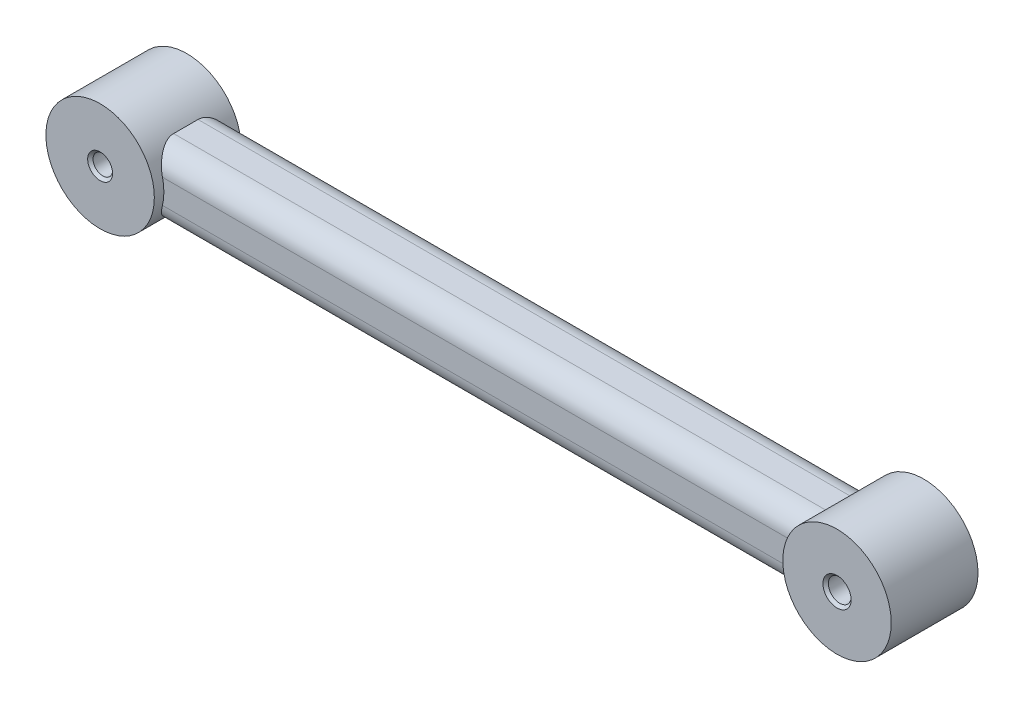
ISO-10303-21;
HEADER;
FILE_DESCRIPTION(('STEP AP214'),'2;1');
FILE_NAME('part.step','',(''),(''),'','','');
FILE_SCHEMA(('AUTOMOTIVE_DESIGN { 1 0 10303 214 1 1 1 1 }'));
ENDSEC;
DATA;
#1=APPLICATION_CONTEXT('core data for automotive mechanical design processes');
#2=APPLICATION_PROTOCOL_DEFINITION('international standard','automotive_design',2000,#1);
#3=PRODUCT_CONTEXT('',#1,'mechanical');
#4=PRODUCT('Part','Part','',(#3));
#5=PRODUCT_RELATED_PRODUCT_CATEGORY('part','',(#4));
#6=PRODUCT_DEFINITION_FORMATION('','',#4);
#7=PRODUCT_DEFINITION_CONTEXT('part definition',#1,'design');
#8=PRODUCT_DEFINITION('design','',#6,#7);
#9=PRODUCT_DEFINITION_SHAPE('','',#8);
#10=(LENGTH_UNIT() NAMED_UNIT(*) SI_UNIT(.MILLI.,.METRE.));
#11=(NAMED_UNIT(*) PLANE_ANGLE_UNIT() SI_UNIT($,.RADIAN.));
#12=(NAMED_UNIT(*) SI_UNIT($,.STERADIAN.) SOLID_ANGLE_UNIT());
#13=UNCERTAINTY_MEASURE_WITH_UNIT(LENGTH_MEASURE(1.E-05),#10,'distance_accuracy_value','');
#14=(GEOMETRIC_REPRESENTATION_CONTEXT(3) GLOBAL_UNCERTAINTY_ASSIGNED_CONTEXT((#13)) GLOBAL_UNIT_ASSIGNED_CONTEXT((#10,
#11,#12)) REPRESENTATION_CONTEXT('',''));
#15=CARTESIAN_POINT('',(0.,0.,0.));
#16=DIRECTION('',(0.,0.,1.));
#17=DIRECTION('',(1.,0.,0.));
#18=AXIS2_PLACEMENT_3D('',#15,#16,#17);
#19=CARTESIAN_POINT('',(0.,0.,1.6));
#20=DIRECTION('',(0.,0.,-1.));
#21=DIRECTION('',(-1.,0.,0.));
#22=AXIS2_PLACEMENT_3D('',#19,#20,#21);
#23=CYLINDRICAL_SURFACE('',#22,2.);
#24=CARTESIAN_POINT('',(0.,0.,-1.6));
#25=DIRECTION('',(0.,0.,1.));
#26=DIRECTION('',(1.,0.,0.));
#27=AXIS2_PLACEMENT_3D('',#24,#25,#26);
#28=CIRCLE('',#27,2.);
#29=CARTESIAN_POINT('',(2.,0.,-1.6));
#30=VERTEX_POINT('',#29);
#31=EDGE_CURVE('E237',#30,#30,#28,.T.);
#32=ORIENTED_EDGE('',*,*,#31,.T.);
#33=EDGE_LOOP('',(#32));
#34=FACE_BOUND('',#33,.T.);
#35=CARTESIAN_POINT('',(0.,0.,1.6));
#36=DIRECTION('',(0.,0.,1.));
#37=DIRECTION('',(1.,0.,0.));
#38=AXIS2_PLACEMENT_3D('',#35,#36,#37);
#39=CIRCLE('',#38,2.);
#40=CARTESIAN_POINT('',(2.,0.,1.6));
#41=VERTEX_POINT('',#40);
#42=EDGE_CURVE('E233',#41,#41,#39,.T.);
#43=ORIENTED_EDGE('',*,*,#42,.F.);
#44=EDGE_LOOP('',(#43));
#45=FACE_BOUND('',#44,.T.);
#46=DIRECTION('',(0.,0.,-1.));
#47=VECTOR('',#46,1.);
#48=CARTESIAN_POINT('',(1.5612494995996,-1.25,1.6));
#49=LINE('',#48,#47);
#50=CARTESIAN_POINT('',(1.5612494995996,-1.25,0.450000000000001));
#51=VERTEX_POINT('',#50);
#52=CARTESIAN_POINT('',(1.5612494995996,-1.25,-0.45));
#53=VERTEX_POINT('',#52);
#54=EDGE_CURVE('E219',#51,#53,#49,.T.);
#55=ORIENTED_EDGE('',*,*,#54,.F.);
#56=CARTESIAN_POINT('',(1.5612494995996,-1.25,0.45));
#57=CARTESIAN_POINT('',(1.56124479428022,-1.250002364679,0.469703834155344));
#58=CARTESIAN_POINT('',(1.56183295074108,-1.24927153588386,0.489395317765744));
#59=CARTESIAN_POINT('',(1.56414858771914,-1.24637255435479,0.528587471484426));
#60=CARTESIAN_POINT('',(1.56587504631508,-1.24420569082532,0.548088296836796));
#61=CARTESIAN_POINT('',(1.57265355833478,-1.23564369882374,0.605764718422303));
#62=CARTESIAN_POINT('',(1.57930646800638,-1.22718597796565,0.643470105465648));
#63=CARTESIAN_POINT('',(1.5960669332859,-1.20530323861858,0.716395942969233));
#64=CARTESIAN_POINT('',(1.60616327133415,-1.19189433787044,0.751624019761468));
#65=CARTESIAN_POINT('',(1.62887659158212,-1.16066109928091,0.819258018595459));
#66=CARTESIAN_POINT('',(1.64149889578509,-1.14282741943866,0.851657771016151));
#67=CARTESIAN_POINT('',(1.66990848408761,-1.10096145860698,0.916817729501131));
#68=CARTESIAN_POINT('',(1.68589310993983,-1.07644967178315,0.949182251801828));
#69=CARTESIAN_POINT('',(1.71878299353934,-1.02311710435887,1.00960930066279));
#70=CARTESIAN_POINT('',(1.73568878390636,-0.994293813661595,1.03766930178723));
#71=CARTESIAN_POINT('',(1.77256367788873,-0.92721693875738,1.09382072076917));
#72=CARTESIAN_POINT('',(1.79253574310543,-0.888199992628021,1.12100636177458));
#73=CARTESIAN_POINT('',(1.83117439570147,-0.805531046068749,1.16823481281907));
#74=CARTESIAN_POINT('',(1.84984238883931,-0.761884168581074,1.18828541282545));
#75=CARTESIAN_POINT('',(1.8833595926855,-0.674506987774179,1.2191298319953));
#76=CARTESIAN_POINT('',(1.89839579822248,-0.631071205150889,1.23054306875258));
#77=CARTESIAN_POINT('',(1.91889376673093,-0.564265641648953,1.24212284582033));
#78=CARTESIAN_POINT('',(1.92539633411464,-0.541667631727136,1.24505975103717));
#79=CARTESIAN_POINT('',(1.93764293008773,-0.496083613033455,1.24899940564504));
#80=CARTESIAN_POINT('',(1.94338640315115,-0.473097333838141,1.25000074575873));
#81=CARTESIAN_POINT('',(1.94871752699051,-0.45,1.25));
#82=B_SPLINE_CURVE_WITH_KNOTS('',3,(#56,#57,#58,#59,#60,#61,#62,#63,#64,#65,#66,#67,#68,#69,#70,
#71,#72,#73,#74,#75,#76,#77,#78,#79,#80,#81),.UNSPECIFIED.,.F.,.F.,(4,2,2,2,2,2,2,2,2,2,2,2,4),
(0.,0.0590660793421097,0.118079203637748,0.23505440101746,0.351652114854425,0.468498127104217,
0.598923157775744,0.72942441773895,0.88344553410579,1.0372979720476,1.17865837614105,
1.24966769193779,1.32072868989235),.UNSPECIFIED.);
#83=CARTESIAN_POINT('',(1.94871752699051,-0.45,1.25));
#84=VERTEX_POINT('',#83);
#85=EDGE_CURVE('E118',#51,#84,#82,.T.);
#86=ORIENTED_EDGE('',*,*,#85,.T.);
#87=CARTESIAN_POINT('',(0.,0.,1.25));
#88=DIRECTION('',(0.,0.,-1.));
#89=DIRECTION('',(-1.,0.,0.));
#90=AXIS2_PLACEMENT_3D('',#87,#88,#89);
#91=CIRCLE('',#90,2.);
#92=CARTESIAN_POINT('',(1.94871752699051,0.45,1.25));
#93=VERTEX_POINT('',#92);
#94=EDGE_CURVE('E218',#84,#93,#91,.F.);
#95=ORIENTED_EDGE('',*,*,#94,.T.);
#96=CARTESIAN_POINT('',(1.94871752699051,0.45,1.25));
#97=CARTESIAN_POINT('',(1.94338425116083,0.473106310050768,1.25000063558548));
#98=CARTESIAN_POINT('',(1.93763853728271,0.496101044505794,1.24899859691571));
#99=CARTESIAN_POINT('',(1.92538658640089,0.541702836848775,1.24505601023878));
#100=CARTESIAN_POINT('',(1.91888086470596,0.564310145634009,1.24211676950984));
#101=CARTESIAN_POINT('',(1.89838873777709,0.631089346347298,1.23053666798972));
#102=CARTESIAN_POINT('',(1.88336348007658,0.674492429826167,1.21913175950723));
#103=CARTESIAN_POINT('',(1.85133334222158,0.758001767367756,1.18965912006261));
#104=CARTESIAN_POINT('',(1.83433328040023,0.798115654751751,1.17160738235327));
#105=CARTESIAN_POINT('',(1.79914706863792,0.874553038881213,1.12945760485428));
#106=CARTESIAN_POINT('',(1.78095882710302,0.91086954196344,1.10534867790625));
#107=CARTESIAN_POINT('',(1.74277618145345,0.982091956315179,1.04925982679008));
#108=CARTESIAN_POINT('',(1.72276420051192,1.01658962475138,1.01677262281048));
#109=CARTESIAN_POINT('',(1.68397655896571,1.07962539252384,0.945804261028445));
#110=CARTESIAN_POINT('',(1.66520041451233,1.10816583382209,0.907325469122972));
#111=CARTESIAN_POINT('',(1.63391881310515,1.15365721123185,0.832626911371097));
#112=CARTESIAN_POINT('',(1.62089769828072,1.17177780146066,0.797336304039981));
#113=CARTESIAN_POINT('',(1.59801388195562,1.20279757990867,0.72365280845195));
#114=CARTESIAN_POINT('',(1.58814151632969,1.21571277730878,0.685269874441344));
#115=CARTESIAN_POINT('',(1.57424806585875,1.23363312678441,0.614227371281108));
#116=CARTESIAN_POINT('',(1.5694450551216,1.23971316496546,0.581992767531099));
#117=CARTESIAN_POINT('',(1.56291265911081,1.24792324765895,0.516528801126634));
#118=CARTESIAN_POINT('',(1.56120186968704,1.25002939749622,0.483294634017954));
#119=CARTESIAN_POINT('',(1.5612494995996,1.25,0.45));
#120=B_SPLINE_CURVE_WITH_KNOTS('',3,(#96,#97,#98,#99,#100,#101,#102,#103,#104,#105,#106,#107,
#108,#109,#110,#111,#112,#113,#114,#115,#116,#117,#118,#119),.UNSPECIFIED.,.F.,.F.,(4,2,2,2,2,2,
2,2,2,2,2,4),(0.,0.071087690328124,0.142127457741706,0.283374885535946,0.424284648686768,
0.565449517193962,0.719088835422086,0.872667639259163,0.997450974212655,1.1218475547457,
1.22092759027445,1.32060151077974),.UNSPECIFIED.);
#121=CARTESIAN_POINT('',(1.5612494995996,1.25,0.450000000000001));
#122=VERTEX_POINT('',#121);
#123=EDGE_CURVE('E63',#93,#122,#120,.T.);
#124=ORIENTED_EDGE('',*,*,#123,.T.);
#125=DIRECTION('',(0.,0.,-1.));
#126=VECTOR('',#125,1.);
#127=CARTESIAN_POINT('',(1.5612494995996,1.25,1.6));
#128=LINE('',#127,#126);
#129=CARTESIAN_POINT('',(1.5612494995996,1.25,-0.45));
#130=VERTEX_POINT('',#129);
#131=EDGE_CURVE('E212',#122,#130,#128,.T.);
#132=ORIENTED_EDGE('',*,*,#131,.T.);
#133=CARTESIAN_POINT('',(1.5612494995996,1.25,-0.45));
#134=CARTESIAN_POINT('',(1.56124479428022,1.250002364679,-0.469703834155343));
#135=CARTESIAN_POINT('',(1.56183295074108,1.24927153588386,-0.489395317765743));
#136=CARTESIAN_POINT('',(1.56414858771914,1.24637255435479,-0.528587471484425));
#137=CARTESIAN_POINT('',(1.56587504631508,1.24420569082532,-0.548088296836795));
#138=CARTESIAN_POINT('',(1.57265355833478,1.23564369882374,-0.605764718422302));
#139=CARTESIAN_POINT('',(1.57930646800638,1.22718597796565,-0.643470105465647));
#140=CARTESIAN_POINT('',(1.59606693328591,1.20530323861858,-0.716395942969233));
#141=CARTESIAN_POINT('',(1.60616327133415,1.19189433787044,-0.751624019761467));
#142=CARTESIAN_POINT('',(1.62887659158212,1.16066109928091,-0.819258018595458));
#143=CARTESIAN_POINT('',(1.64149889578509,1.14282741943866,-0.85165777101615));
#144=CARTESIAN_POINT('',(1.66990848408761,1.10096145860698,-0.91681772950113));
#145=CARTESIAN_POINT('',(1.68589310993983,1.07644967178315,-0.949182251801827));
#146=CARTESIAN_POINT('',(1.71878299353934,1.02311710435887,-1.00960930066279));
#147=CARTESIAN_POINT('',(1.73568878390636,0.994293813661594,-1.03766930178723));
#148=CARTESIAN_POINT('',(1.77256367788873,0.927216938757379,-1.09382072076917));
#149=CARTESIAN_POINT('',(1.79253574310543,0.88819999262802,-1.12100636177458));
#150=CARTESIAN_POINT('',(1.83117439570147,0.805531046068748,-1.16823481281907));
#151=CARTESIAN_POINT('',(1.84984238883931,0.761884168581073,-1.18828541282545));
#152=CARTESIAN_POINT('',(1.8833595926855,0.674506987774178,-1.2191298319953));
#153=CARTESIAN_POINT('',(1.89839579822248,0.631071205150887,-1.23054306875258));
#154=CARTESIAN_POINT('',(1.91889376673094,0.564265641648952,-1.24212284582033));
#155=CARTESIAN_POINT('',(1.92539633411464,0.541667631727135,-1.24505975103717));
#156=CARTESIAN_POINT('',(1.93764293008773,0.496083613033454,-1.24899940564504));
#157=CARTESIAN_POINT('',(1.94338640315115,0.47309733383814,-1.25000074575873));
#158=CARTESIAN_POINT('',(1.94871752699051,0.45,-1.25));
#159=B_SPLINE_CURVE_WITH_KNOTS('',3,(#133,#134,#135,#136,#137,#138,#139,#140,#141,#142,#143,
#144,#145,#146,#147,#148,#149,#150,#151,#152,#153,#154,#155,#156,#157,#158),.UNSPECIFIED.,.F.,
.F.,(4,2,2,2,2,2,2,2,2,2,2,2,4),(0.,0.0590660793421097,0.118079203637748,0.23505440101746,
0.351652114854425,0.468498127104217,0.598923157775744,0.72942441773895,0.88344553410579,
1.0372979720476,1.17865837614105,1.24966769193779,1.32072868989235),.UNSPECIFIED.);
#160=CARTESIAN_POINT('',(1.94871752699051,0.45,-1.25));
#161=VERTEX_POINT('',#160);
#162=EDGE_CURVE('E49',#130,#161,#159,.T.);
#163=ORIENTED_EDGE('',*,*,#162,.T.);
#164=CARTESIAN_POINT('',(0.,0.,-1.25));
#165=DIRECTION('',(0.,0.,-1.));
#166=DIRECTION('',(-1.,0.,0.));
#167=AXIS2_PLACEMENT_3D('',#164,#165,#166);
#168=CIRCLE('',#167,2.);
#169=CARTESIAN_POINT('',(1.94871752699051,-0.45,-1.25));
#170=VERTEX_POINT('',#169);
#171=EDGE_CURVE('E211',#170,#161,#168,.F.);
#172=ORIENTED_EDGE('',*,*,#171,.F.);
#173=CARTESIAN_POINT('',(1.94871752699051,-0.45,-1.25));
#174=CARTESIAN_POINT('',(1.94338425116083,-0.473106310050769,-1.25000063558548));
#175=CARTESIAN_POINT('',(1.93763853728271,-0.496101044505794,-1.24899859691571));
#176=CARTESIAN_POINT('',(1.92538658640089,-0.541702836848776,-1.24505601023877));
#177=CARTESIAN_POINT('',(1.91888086470596,-0.564310145634009,-1.24211676950984));
#178=CARTESIAN_POINT('',(1.89838873777709,-0.631089346347298,-1.23053666798971));
#179=CARTESIAN_POINT('',(1.88336348007658,-0.674492429826168,-1.21913175950723));
#180=CARTESIAN_POINT('',(1.85133334222158,-0.758001767367757,-1.18965912006261));
#181=CARTESIAN_POINT('',(1.83433328040023,-0.798115654751752,-1.17160738235327));
#182=CARTESIAN_POINT('',(1.79914706863792,-0.874553038881214,-1.12945760485428));
#183=CARTESIAN_POINT('',(1.78095882710302,-0.910869541963441,-1.10534867790625));
#184=CARTESIAN_POINT('',(1.74277618145345,-0.98209195631518,-1.04925982679007));
#185=CARTESIAN_POINT('',(1.72276420051192,-1.01658962475138,-1.01677262281048));
#186=CARTESIAN_POINT('',(1.68397655896571,-1.07962539252384,-0.945804261028444));
#187=CARTESIAN_POINT('',(1.66520041451233,-1.10816583382209,-0.907325469122971));
#188=CARTESIAN_POINT('',(1.63391881310515,-1.15365721123185,-0.832626911371095));
#189=CARTESIAN_POINT('',(1.62089769828072,-1.17177780146066,-0.79733630403998));
#190=CARTESIAN_POINT('',(1.59801388195562,-1.20279757990867,-0.723652808451949));
#191=CARTESIAN_POINT('',(1.58814151632969,-1.21571277730878,-0.685269874441342));
#192=CARTESIAN_POINT('',(1.57424806585875,-1.23363312678441,-0.614227371281107));
#193=CARTESIAN_POINT('',(1.5694450551216,-1.23971316496546,-0.581992767531098));
#194=CARTESIAN_POINT('',(1.56291265911081,-1.24792324765895,-0.516528801126633));
#195=CARTESIAN_POINT('',(1.56120186968704,-1.25002939749622,-0.483294634017953));
#196=CARTESIAN_POINT('',(1.5612494995996,-1.25,-0.45));
#197=B_SPLINE_CURVE_WITH_KNOTS('',3,(#173,#174,#175,#176,#177,#178,#179,#180,#181,#182,#183,
#184,#185,#186,#187,#188,#189,#190,#191,#192,#193,#194,#195,#196),.UNSPECIFIED.,.F.,.F.,(4,2,2,
2,2,2,2,2,2,2,2,4),(0.,0.0710876903281239,0.142127457741706,0.283374885535946,0.424284648686768,
0.565449517193962,0.719088835422086,0.872667639259164,0.997450974212656,1.1218475547457,
1.22092759027445,1.32060151077974),.UNSPECIFIED.);
#198=EDGE_CURVE('E117',#170,#53,#197,.T.);
#199=ORIENTED_EDGE('',*,*,#198,.T.);
#200=EDGE_LOOP('',(#55,#86,#95,#124,#132,#163,#172,#199));
#201=FACE_BOUND('',#200,.T.);
#202=ADVANCED_FACE('F36',(#34,#45,#201),#23,.T.);
#203=CARTESIAN_POINT('',(0.,0.,1.6));
#204=DIRECTION('',(0.,0.,1.));
#205=DIRECTION('',(1.,0.,0.));
#206=AXIS2_PLACEMENT_3D('',#203,#204,#205);
#207=PLANE('',#206);
#208=CARTESIAN_POINT('',(0.,0.,1.6));
#209=DIRECTION('',(0.,0.,1.));
#210=DIRECTION('',(1.,0.,0.));
#211=AXIS2_PLACEMENT_3D('',#208,#209,#210);
#212=CIRCLE('',#211,0.459999999999999);
#213=CARTESIAN_POINT('',(0.459999999999999,0.,1.6));
#214=VERTEX_POINT('',#213);
#215=EDGE_CURVE('E257',#214,#214,#212,.F.);
#216=ORIENTED_EDGE('',*,*,#215,.T.);
#217=EDGE_LOOP('',(#216));
#218=FACE_BOUND('',#217,.T.);
#219=ORIENTED_EDGE('',*,*,#42,.T.);
#220=EDGE_LOOP('',(#219));
#221=FACE_BOUND('',#220,.T.);
#222=ADVANCED_FACE('F275',(#218,#221),#207,.T.);
#223=CARTESIAN_POINT('',(0.,0.,-1.6));
#224=DIRECTION('',(0.,0.,1.));
#225=DIRECTION('',(1.,0.,0.));
#226=AXIS2_PLACEMENT_3D('',#223,#224,#225);
#227=PLANE('',#226);
#228=CARTESIAN_POINT('',(0.,0.,-1.6));
#229=DIRECTION('',(0.,0.,1.));
#230=DIRECTION('',(1.,0.,0.));
#231=AXIS2_PLACEMENT_3D('',#228,#229,#230);
#232=CIRCLE('',#231,0.459999999999995);
#233=CARTESIAN_POINT('',(0.459999999999995,0.,-1.6));
#234=VERTEX_POINT('',#233);
#235=EDGE_CURVE('E136',#234,#234,#232,.T.);
#236=ORIENTED_EDGE('',*,*,#235,.T.);
#237=EDGE_LOOP('',(#236));
#238=FACE_BOUND('',#237,.T.);
#239=ORIENTED_EDGE('',*,*,#31,.F.);
#240=EDGE_LOOP('',(#239));
#241=FACE_BOUND('',#240,.T.);
#242=ADVANCED_FACE('F262',(#238,#241),#227,.F.);
#243=CARTESIAN_POINT('',(0.,0.,1.6));
#244=DIRECTION('',(0.,0.,-1.));
#245=DIRECTION('',(-1.,0.,0.));
#246=AXIS2_PLACEMENT_3D('',#243,#244,#245);
#247=CYLINDRICAL_SURFACE('',#246,0.36);
#248=CARTESIAN_POINT('',(0.,0.,1.5));
#249=DIRECTION('',(0.,0.,1.));
#250=DIRECTION('',(1.,0.,0.));
#251=AXIS2_PLACEMENT_3D('',#248,#249,#250);
#252=CIRCLE('',#251,0.36);
#253=CARTESIAN_POINT('',(0.36,0.,1.5));
#254=VERTEX_POINT('',#253);
#255=EDGE_CURVE('E254',#254,#254,#252,.T.);
#256=ORIENTED_EDGE('',*,*,#255,.T.);
#257=EDGE_LOOP('',(#256));
#258=FACE_BOUND('',#257,.T.);
#259=CARTESIAN_POINT('',(0.,0.,-1.5));
#260=DIRECTION('',(0.,0.,1.));
#261=DIRECTION('',(1.,0.,0.));
#262=AXIS2_PLACEMENT_3D('',#259,#260,#261);
#263=CIRCLE('',#262,0.36);
#264=CARTESIAN_POINT('',(0.36,0.,-1.5));
#265=VERTEX_POINT('',#264);
#266=EDGE_CURVE('E251',#265,#265,#263,.F.);
#267=ORIENTED_EDGE('',*,*,#266,.T.);
#268=EDGE_LOOP('',(#267));
#269=FACE_BOUND('',#268,.T.);
#270=ADVANCED_FACE('F287',(#258,#269),#247,.F.);
#271=CARTESIAN_POINT('',(29.181718048039,-1.25,0.));
#272=DIRECTION('',(0.,1.,0.));
#273=DIRECTION('',(0.,0.,1.));
#274=AXIS2_PLACEMENT_3D('',#271,#272,#273);
#275=PLANE('',#274);
#276=DIRECTION('',(0.,0.,-1.));
#277=VECTOR('',#276,1.);
#278=CARTESIAN_POINT('',(25.6194685484394,-1.25,1.6));
#279=LINE('',#278,#277);
#280=CARTESIAN_POINT('',(25.6194685484394,-1.25,0.450000000000001));
#281=VERTEX_POINT('',#280);
#282=CARTESIAN_POINT('',(25.6194685484394,-1.25,-0.45));
#283=VERTEX_POINT('',#282);
#284=EDGE_CURVE('E110',#281,#283,#279,.T.);
#285=ORIENTED_EDGE('',*,*,#284,.F.);
#286=DIRECTION('',(-1.,0.,0.));
#287=VECTOR('',#286,1.);
#288=CARTESIAN_POINT('',(1.5612494995996,-1.25,0.45));
#289=LINE('',#288,#287);
#290=EDGE_CURVE('E124',#281,#51,#289,.T.);
#291=ORIENTED_EDGE('',*,*,#290,.T.);
#292=ORIENTED_EDGE('',*,*,#54,.T.);
#293=DIRECTION('',(-1.,0.,0.));
#294=VECTOR('',#293,1.);
#295=CARTESIAN_POINT('',(29.181718048039,-1.25,-0.45));
#296=LINE('',#295,#294);
#297=EDGE_CURVE('E127',#53,#283,#296,.F.);
#298=ORIENTED_EDGE('',*,*,#297,.T.);
#299=EDGE_LOOP('',(#285,#291,#292,#298));
#300=FACE_BOUND('',#299,.T.);
#301=ADVANCED_FACE('F122',(#300),#275,.F.);
#302=CARTESIAN_POINT('',(29.181718048039,0.,-1.25));
#303=DIRECTION('',(0.,0.,1.));
#304=DIRECTION('',(1.,0.,0.));
#305=AXIS2_PLACEMENT_3D('',#302,#303,#304);
#306=PLANE('',#305);
#307=CARTESIAN_POINT('',(27.180718048039,0.,-1.25));
#308=DIRECTION('',(0.,0.,1.));
#309=DIRECTION('',(1.,0.,0.));
#310=AXIS2_PLACEMENT_3D('',#307,#308,#309);
#311=CIRCLE('',#310,2.);
#312=CARTESIAN_POINT('',(25.2320005210485,-0.450000000000001,-1.25));
#313=VERTEX_POINT('',#312);
#314=CARTESIAN_POINT('',(25.2320005210485,0.45,-1.25));
#315=VERTEX_POINT('',#314);
#316=EDGE_CURVE('E128',#313,#315,#311,.F.);
#317=ORIENTED_EDGE('',*,*,#316,.F.);
#318=DIRECTION('',(-1.,0.,0.));
#319=VECTOR('',#318,1.);
#320=CARTESIAN_POINT('',(29.181718048039,-0.45,-1.25));
#321=LINE('',#320,#319);
#322=EDGE_CURVE('E143',#313,#170,#321,.T.);
#323=ORIENTED_EDGE('',*,*,#322,.T.);
#324=ORIENTED_EDGE('',*,*,#171,.T.);
#325=DIRECTION('',(-1.,0.,0.));
#326=VECTOR('',#325,1.);
#327=CARTESIAN_POINT('',(25.6194685484394,0.45,-1.25));
#328=LINE('',#327,#326);
#329=EDGE_CURVE('E141',#161,#315,#328,.F.);
#330=ORIENTED_EDGE('',*,*,#329,.T.);
#331=EDGE_LOOP('',(#317,#323,#324,#330));
#332=FACE_BOUND('',#331,.T.);
#333=ADVANCED_FACE('F215',(#332),#306,.F.);
#334=CARTESIAN_POINT('',(29.181718048039,1.25,0.));
#335=DIRECTION('',(0.,1.,0.));
#336=DIRECTION('',(0.,0.,1.));
#337=AXIS2_PLACEMENT_3D('',#334,#335,#336);
#338=PLANE('',#337);
#339=ORIENTED_EDGE('',*,*,#131,.F.);
#340=DIRECTION('',(-1.,0.,0.));
#341=VECTOR('',#340,1.);
#342=CARTESIAN_POINT('',(29.181718048039,1.25,0.45));
#343=LINE('',#342,#341);
#344=CARTESIAN_POINT('',(25.6194685484394,1.25,0.450000000000001));
#345=VERTEX_POINT('',#344);
#346=EDGE_CURVE('E148',#122,#345,#343,.F.);
#347=ORIENTED_EDGE('',*,*,#346,.T.);
#348=DIRECTION('',(0.,0.,-1.));
#349=VECTOR('',#348,1.);
#350=CARTESIAN_POINT('',(25.6194685484394,1.25,1.6));
#351=LINE('',#350,#349);
#352=CARTESIAN_POINT('',(25.6194685484394,1.25,-0.45));
#353=VERTEX_POINT('',#352);
#354=EDGE_CURVE('E224',#345,#353,#351,.T.);
#355=ORIENTED_EDGE('',*,*,#354,.T.);
#356=DIRECTION('',(-1.,0.,0.));
#357=VECTOR('',#356,1.);
#358=CARTESIAN_POINT('',(1.5612494995996,1.25,-0.45));
#359=LINE('',#358,#357);
#360=EDGE_CURVE('E146',#353,#130,#359,.T.);
#361=ORIENTED_EDGE('',*,*,#360,.T.);
#362=EDGE_LOOP('',(#339,#347,#355,#361));
#363=FACE_BOUND('',#362,.T.);
#364=ADVANCED_FACE('F227',(#363),#338,.T.);
#365=CARTESIAN_POINT('',(29.181718048039,0.,1.25));
#366=DIRECTION('',(0.,0.,1.));
#367=DIRECTION('',(1.,0.,0.));
#368=AXIS2_PLACEMENT_3D('',#365,#366,#367);
#369=PLANE('',#368);
#370=ORIENTED_EDGE('',*,*,#94,.F.);
#371=DIRECTION('',(-1.,0.,0.));
#372=VECTOR('',#371,1.);
#373=CARTESIAN_POINT('',(25.6194685484394,-0.45,1.25));
#374=LINE('',#373,#372);
#375=CARTESIAN_POINT('',(25.2320005210485,-0.450000000000001,1.25));
#376=VERTEX_POINT('',#375);
#377=EDGE_CURVE('E134',#84,#376,#374,.F.);
#378=ORIENTED_EDGE('',*,*,#377,.T.);
#379=CARTESIAN_POINT('',(27.180718048039,0.,1.25));
#380=DIRECTION('',(0.,0.,1.));
#381=DIRECTION('',(1.,0.,0.));
#382=AXIS2_PLACEMENT_3D('',#379,#380,#381);
#383=CIRCLE('',#382,2.);
#384=CARTESIAN_POINT('',(25.2320005210485,0.45,1.25));
#385=VERTEX_POINT('',#384);
#386=EDGE_CURVE('E113',#376,#385,#383,.F.);
#387=ORIENTED_EDGE('',*,*,#386,.T.);
#388=DIRECTION('',(-1.,0.,0.));
#389=VECTOR('',#388,1.);
#390=CARTESIAN_POINT('',(29.181718048039,0.45,1.25));
#391=LINE('',#390,#389);
#392=EDGE_CURVE('E131',#385,#93,#391,.T.);
#393=ORIENTED_EDGE('',*,*,#392,.T.);
#394=EDGE_LOOP('',(#370,#378,#387,#393));
#395=FACE_BOUND('',#394,.T.);
#396=ADVANCED_FACE('F194',(#395),#369,.T.);
#397=CARTESIAN_POINT('',(27.180718048039,0.,1.6));
#398=DIRECTION('',(0.,0.,-1.));
#399=DIRECTION('',(-1.,0.,0.));
#400=AXIS2_PLACEMENT_3D('',#397,#398,#399);
#401=CYLINDRICAL_SURFACE('',#400,2.);
#402=CARTESIAN_POINT('',(27.180718048039,0.,1.6));
#403=DIRECTION('',(0.,0.,1.));
#404=DIRECTION('',(1.,0.,0.));
#405=AXIS2_PLACEMENT_3D('',#402,#403,#404);
#406=CIRCLE('',#405,2.);
#407=CARTESIAN_POINT('',(29.180718048039,0.,1.6));
#408=VERTEX_POINT('',#407);
#409=EDGE_CURVE('E416',#408,#408,#406,.T.);
#410=ORIENTED_EDGE('',*,*,#409,.F.);
#411=EDGE_LOOP('',(#410));
#412=FACE_BOUND('',#411,.T.);
#413=CARTESIAN_POINT('',(27.180718048039,0.,-1.6));
#414=DIRECTION('',(0.,0.,1.));
#415=DIRECTION('',(1.,0.,0.));
#416=AXIS2_PLACEMENT_3D('',#413,#414,#415);
#417=CIRCLE('',#416,2.);
#418=CARTESIAN_POINT('',(29.180718048039,0.,-1.6));
#419=VERTEX_POINT('',#418);
#420=EDGE_CURVE('E418',#419,#419,#417,.T.);
#421=ORIENTED_EDGE('',*,*,#420,.T.);
#422=EDGE_LOOP('',(#421));
#423=FACE_BOUND('',#422,.T.);
#424=ORIENTED_EDGE('',*,*,#386,.F.);
#425=CARTESIAN_POINT('',(25.2320005210485,-0.45,1.25));
#426=CARTESIAN_POINT('',(25.2373337968782,-0.473106310050769,1.25000063558548));
#427=CARTESIAN_POINT('',(25.2430795107563,-0.496101044505795,1.24899859691571));
#428=CARTESIAN_POINT('',(25.2553314616381,-0.541702836848777,1.24505601023878));
#429=CARTESIAN_POINT('',(25.261837183333,-0.56431014563401,1.24211676950984));
#430=CARTESIAN_POINT('',(25.2823293102619,-0.631089346347299,1.23053666798971));
#431=CARTESIAN_POINT('',(25.2973545679624,-0.674492429826169,1.21913175950723));
#432=CARTESIAN_POINT('',(25.3293847058174,-0.758001767367757,1.18965912006261));
#433=CARTESIAN_POINT('',(25.3463847676388,-0.798115654751752,1.17160738235327));
#434=CARTESIAN_POINT('',(25.3815709794011,-0.874553038881214,1.12945760485428));
#435=CARTESIAN_POINT('',(25.399759220936,-0.910869541963441,1.10534867790625));
#436=CARTESIAN_POINT('',(25.4379418665856,-0.982091956315181,1.04925982679008));
#437=CARTESIAN_POINT('',(25.4579538475271,-1.01658962475138,1.01677262281048));
#438=CARTESIAN_POINT('',(25.4967414890733,-1.07962539252384,0.945804261028445));
#439=CARTESIAN_POINT('',(25.5155176335267,-1.10816583382209,0.907325469122972));
#440=CARTESIAN_POINT('',(25.5467992349339,-1.15365721123185,0.832626911371096));
#441=CARTESIAN_POINT('',(25.5598203497583,-1.17177780146066,0.79733630403998));
#442=CARTESIAN_POINT('',(25.5827041660834,-1.20279757990867,0.723652808451949));
#443=CARTESIAN_POINT('',(25.5925765317093,-1.21571277730878,0.685269874441343));
#444=CARTESIAN_POINT('',(25.6064699821803,-1.23363312678441,0.614227371281108));
#445=CARTESIAN_POINT('',(25.6112729929174,-1.23971316496546,0.581992767531098));
#446=CARTESIAN_POINT('',(25.6178053889282,-1.24792324765895,0.516528801126633));
#447=CARTESIAN_POINT('',(25.619516178352,-1.25002939749622,0.483294634017953));
#448=CARTESIAN_POINT('',(25.6194685484394,-1.25,0.45));
#449=B_SPLINE_CURVE_WITH_KNOTS('',3,(#425,#426,#427,#428,#429,#430,#431,#432,#433,#434,#435,
#436,#437,#438,#439,#440,#441,#442,#443,#444,#445,#446,#447,#448),.UNSPECIFIED.,.F.,.F.,(4,2,2,
2,2,2,2,2,2,2,2,4),(0.,0.0710876903281248,0.142127457741707,0.283374885535946,0.424284648686768,
0.565449517193963,0.719088835422086,0.872667639259164,0.997450974212657,1.1218475547457,
1.22092759027445,1.32060151077974),.UNSPECIFIED.);
#450=EDGE_CURVE('E107',#376,#281,#449,.T.);
#451=ORIENTED_EDGE('',*,*,#450,.T.);
#452=ORIENTED_EDGE('',*,*,#284,.T.);
#453=CARTESIAN_POINT('',(25.6194685484394,-1.25,-0.45));
#454=CARTESIAN_POINT('',(25.6194732537588,-1.250002364679,-0.469703834155343));
#455=CARTESIAN_POINT('',(25.6188850972979,-1.24927153588386,-0.489395317765743));
#456=CARTESIAN_POINT('',(25.6165694603199,-1.24637255435479,-0.528587471484425));
#457=CARTESIAN_POINT('',(25.6148430017239,-1.24420569082532,-0.548088296836795));
#458=CARTESIAN_POINT('',(25.6080644897042,-1.23564369882374,-0.605764718422302));
#459=CARTESIAN_POINT('',(25.6014115800326,-1.22718597796565,-0.643470105465647));
#460=CARTESIAN_POINT('',(25.5846511147531,-1.20530323861858,-0.716395942969233));
#461=CARTESIAN_POINT('',(25.5745547767048,-1.19189433787044,-0.751624019761468));
#462=CARTESIAN_POINT('',(25.5518414564569,-1.16066109928091,-0.819258018595459));
#463=CARTESIAN_POINT('',(25.5392191522539,-1.14282741943866,-0.851657771016151));
#464=CARTESIAN_POINT('',(25.5108095639514,-1.10096145860698,-0.91681772950113));
#465=CARTESIAN_POINT('',(25.4948249380992,-1.07644967178315,-0.949182251801828));
#466=CARTESIAN_POINT('',(25.4619350544997,-1.02311710435887,-1.00960930066279));
#467=CARTESIAN_POINT('',(25.4450292641326,-0.994293813661595,-1.03766930178723));
#468=CARTESIAN_POINT('',(25.4081543701503,-0.92721693875738,-1.09382072076917));
#469=CARTESIAN_POINT('',(25.3881823049336,-0.88819999262802,-1.12100636177458));
#470=CARTESIAN_POINT('',(25.3495436523375,-0.805531046068747,-1.16823481281907));
#471=CARTESIAN_POINT('',(25.3308756591997,-0.761884168581073,-1.18828541282545));
#472=CARTESIAN_POINT('',(25.2973584553535,-0.674506987774178,-1.2191298319953));
#473=CARTESIAN_POINT('',(25.2823222498165,-0.631071205150889,-1.23054306875258));
#474=CARTESIAN_POINT('',(25.2618242813081,-0.564265641648953,-1.24212284582033));
#475=CARTESIAN_POINT('',(25.2553217139244,-0.541667631727137,-1.24505975103717));
#476=CARTESIAN_POINT('',(25.2430751179513,-0.496083613033455,-1.24899940564504));
#477=CARTESIAN_POINT('',(25.2373316448878,-0.473097333838141,-1.25000074575873));
#478=CARTESIAN_POINT('',(25.2320005210485,-0.450000000000001,-1.25));
#479=B_SPLINE_CURVE_WITH_KNOTS('',3,(#453,#454,#455,#456,#457,#458,#459,#460,#461,#462,#463,
#464,#465,#466,#467,#468,#469,#470,#471,#472,#473,#474,#475,#476,#477,#478),.UNSPECIFIED.,.F.,
.F.,(4,2,2,2,2,2,2,2,2,2,2,2,4),(0.,0.0590660793421097,0.118079203637748,0.23505440101746,
0.351652114854426,0.468498127104217,0.598923157775743,0.72942441773895,0.883445534105791,
1.0372979720476,1.17865837614105,1.24966769193779,1.32072868989235),.UNSPECIFIED.);
#480=EDGE_CURVE('E180',#283,#313,#479,.T.);
#481=ORIENTED_EDGE('',*,*,#480,.T.);
#482=ORIENTED_EDGE('',*,*,#316,.T.);
#483=CARTESIAN_POINT('',(25.2320005210485,0.45,-1.25));
#484=CARTESIAN_POINT('',(25.2373337968782,0.473106310050768,-1.25000063558548));
#485=CARTESIAN_POINT('',(25.2430795107563,0.496101044505794,-1.24899859691571));
#486=CARTESIAN_POINT('',(25.2553314616381,0.541702836848776,-1.24505601023877));
#487=CARTESIAN_POINT('',(25.261837183333,0.564310145634009,-1.24211676950984));
#488=CARTESIAN_POINT('',(25.2823293102619,0.631089346347298,-1.23053666798971));
#489=CARTESIAN_POINT('',(25.2973545679624,0.674492429826168,-1.21913175950723));
#490=CARTESIAN_POINT('',(25.3293847058174,0.758001767367755,-1.18965912006261));
#491=CARTESIAN_POINT('',(25.3463847676388,0.798115654751751,-1.17160738235327));
#492=CARTESIAN_POINT('',(25.3815709794011,0.874553038881213,-1.12945760485428));
#493=CARTESIAN_POINT('',(25.399759220936,0.91086954196344,-1.10534867790625));
#494=CARTESIAN_POINT('',(25.4379418665856,0.98209195631518,-1.04925982679007));
#495=CARTESIAN_POINT('',(25.4579538475271,1.01658962475138,-1.01677262281048));
#496=CARTESIAN_POINT('',(25.4967414890733,1.07962539252384,-0.945804261028443));
#497=CARTESIAN_POINT('',(25.5155176335267,1.10816583382209,-0.907325469122971));
#498=CARTESIAN_POINT('',(25.5467992349339,1.15365721123185,-0.832626911371096));
#499=CARTESIAN_POINT('',(25.5598203497583,1.17177780146066,-0.797336304039981));
#500=CARTESIAN_POINT('',(25.5827041660834,1.20279757990867,-0.72365280845195));
#501=CARTESIAN_POINT('',(25.5925765317093,1.21571277730878,-0.685269874441343));
#502=CARTESIAN_POINT('',(25.6064699821803,1.23363312678441,-0.614227371281108));
#503=CARTESIAN_POINT('',(25.6112729929174,1.23971316496546,-0.581992767531099));
#504=CARTESIAN_POINT('',(25.6178053889282,1.24792324765895,-0.516528801126633));
#505=CARTESIAN_POINT('',(25.619516178352,1.25002939749622,-0.483294634017953));
#506=CARTESIAN_POINT('',(25.6194685484394,1.25,-0.45));
#507=B_SPLINE_CURVE_WITH_KNOTS('',3,(#483,#484,#485,#486,#487,#488,#489,#490,#491,#492,#493,
#494,#495,#496,#497,#498,#499,#500,#501,#502,#503,#504,#505,#506),.UNSPECIFIED.,.F.,.F.,(4,2,2,
2,2,2,2,2,2,2,2,4),(0.,0.0710876903281244,0.142127457741706,0.283374885535946,0.424284648686767,
0.565449517193962,0.719088835422087,0.872667639259164,0.997450974212655,1.1218475547457,
1.22092759027445,1.32060151077974),.UNSPECIFIED.);
#508=EDGE_CURVE('E11',#315,#353,#507,.T.);
#509=ORIENTED_EDGE('',*,*,#508,.T.);
#510=ORIENTED_EDGE('',*,*,#354,.F.);
#511=CARTESIAN_POINT('',(25.6194685484394,1.25,0.45));
#512=CARTESIAN_POINT('',(25.6194732537588,1.250002364679,0.469703834155344));
#513=CARTESIAN_POINT('',(25.6188850972979,1.24927153588386,0.489395317765744));
#514=CARTESIAN_POINT('',(25.6165694603199,1.24637255435479,0.528587471484426));
#515=CARTESIAN_POINT('',(25.6148430017239,1.24420569082532,0.548088296836796));
#516=CARTESIAN_POINT('',(25.6080644897042,1.23564369882374,0.605764718422303));
#517=CARTESIAN_POINT('',(25.6014115800326,1.22718597796565,0.643470105465648));
#518=CARTESIAN_POINT('',(25.5846511147531,1.20530323861858,0.716395942969233));
#519=CARTESIAN_POINT('',(25.5745547767048,1.19189433787044,0.751624019761468));
#520=CARTESIAN_POINT('',(25.5518414564569,1.16066109928091,0.819258018595459));
#521=CARTESIAN_POINT('',(25.5392191522539,1.14282741943866,0.851657771016151));
#522=CARTESIAN_POINT('',(25.5108095639514,1.10096145860698,0.916817729501131));
#523=CARTESIAN_POINT('',(25.4948249380992,1.07644967178315,0.949182251801828));
#524=CARTESIAN_POINT('',(25.4619350544997,1.02311710435887,1.00960930066279));
#525=CARTESIAN_POINT('',(25.4450292641326,0.994293813661595,1.03766930178723));
#526=CARTESIAN_POINT('',(25.4081543701503,0.92721693875738,1.09382072076917));
#527=CARTESIAN_POINT('',(25.3881823049336,0.88819999262802,1.12100636177458));
#528=CARTESIAN_POINT('',(25.3495436523375,0.805531046068747,1.16823481281907));
#529=CARTESIAN_POINT('',(25.3308756591997,0.761884168581072,1.18828541282545));
#530=CARTESIAN_POINT('',(25.2973584553535,0.674506987774178,1.2191298319953));
#531=CARTESIAN_POINT('',(25.2823222498165,0.631071205150888,1.23054306875258));
#532=CARTESIAN_POINT('',(25.2618242813081,0.564265641648953,1.24212284582033));
#533=CARTESIAN_POINT('',(25.2553217139244,0.541667631727136,1.24505975103717));
#534=CARTESIAN_POINT('',(25.2430751179513,0.496083613033455,1.24899940564504));
#535=CARTESIAN_POINT('',(25.2373316448878,0.473097333838141,1.25000074575873));
#536=CARTESIAN_POINT('',(25.2320005210485,0.45,1.25));
#537=B_SPLINE_CURVE_WITH_KNOTS('',3,(#511,#512,#513,#514,#515,#516,#517,#518,#519,#520,#521,
#522,#523,#524,#525,#526,#527,#528,#529,#530,#531,#532,#533,#534,#535,#536),.UNSPECIFIED.,.F.,
.F.,(4,2,2,2,2,2,2,2,2,2,2,2,4),(0.,0.0590660793421097,0.118079203637748,0.23505440101746,
0.351652114854425,0.468498127104217,0.598923157775743,0.729424417738949,0.88344553410579,
1.0372979720476,1.17865837614105,1.24966769193779,1.32072868989235),.UNSPECIFIED.);
#538=EDGE_CURVE('E202',#345,#385,#537,.T.);
#539=ORIENTED_EDGE('',*,*,#538,.T.);
#540=EDGE_LOOP('',(#424,#451,#452,#481,#482,#509,#510,#539));
#541=FACE_BOUND('',#540,.T.);
#542=ADVANCED_FACE('F109',(#412,#423,#541),#401,.T.);
#543=CARTESIAN_POINT('',(27.180718048039,0.,1.6));
#544=DIRECTION('',(0.,0.,1.));
#545=DIRECTION('',(1.,0.,0.));
#546=AXIS2_PLACEMENT_3D('',#543,#544,#545);
#547=PLANE('',#546);
#548=CARTESIAN_POINT('',(27.180718048039,0.,1.6));
#549=DIRECTION('',(0.,0.,1.));
#550=DIRECTION('',(1.,0.,0.));
#551=AXIS2_PLACEMENT_3D('',#548,#549,#550);
#552=CIRCLE('',#551,0.52);
#553=CARTESIAN_POINT('',(27.700718048039,0.,1.6));
#554=VERTEX_POINT('',#553);
#555=EDGE_CURVE('E245',#554,#554,#552,.F.);
#556=ORIENTED_EDGE('',*,*,#555,.T.);
#557=EDGE_LOOP('',(#556));
#558=FACE_BOUND('',#557,.T.);
#559=ORIENTED_EDGE('',*,*,#409,.T.);
#560=EDGE_LOOP('',(#559));
#561=FACE_BOUND('',#560,.T.);
#562=ADVANCED_FACE('F193',(#558,#561),#547,.T.);
#563=CARTESIAN_POINT('',(27.180718048039,0.,-1.6));
#564=DIRECTION('',(0.,0.,1.));
#565=DIRECTION('',(1.,0.,0.));
#566=AXIS2_PLACEMENT_3D('',#563,#564,#565);
#567=PLANE('',#566);
#568=CARTESIAN_POINT('',(27.180718048039,0.,-1.6));
#569=DIRECTION('',(0.,0.,1.));
#570=DIRECTION('',(1.,0.,0.));
#571=AXIS2_PLACEMENT_3D('',#568,#569,#570);
#572=CIRCLE('',#571,0.520000000000003);
#573=CARTESIAN_POINT('',(27.700718048039,0.,-1.6));
#574=VERTEX_POINT('',#573);
#575=EDGE_CURVE('E248',#574,#574,#572,.T.);
#576=ORIENTED_EDGE('',*,*,#575,.T.);
#577=EDGE_LOOP('',(#576));
#578=FACE_BOUND('',#577,.T.);
#579=ORIENTED_EDGE('',*,*,#420,.F.);
#580=EDGE_LOOP('',(#579));
#581=FACE_BOUND('',#580,.T.);
#582=ADVANCED_FACE('F196',(#578,#581),#567,.F.);
#583=CARTESIAN_POINT('',(27.180718048039,0.,1.6));
#584=DIRECTION('',(0.,0.,-1.));
#585=DIRECTION('',(-1.,0.,0.));
#586=AXIS2_PLACEMENT_3D('',#583,#584,#585);
#587=CYLINDRICAL_SURFACE('',#586,0.420000000000001);
#588=CARTESIAN_POINT('',(27.180718048039,0.,1.50000000000001));
#589=DIRECTION('',(0.,0.,1.));
#590=DIRECTION('',(1.,0.,0.));
#591=AXIS2_PLACEMENT_3D('',#588,#589,#590);
#592=CIRCLE('',#591,0.420000000000001);
#593=CARTESIAN_POINT('',(27.600718048039,0.,1.50000000000001));
#594=VERTEX_POINT('',#593);
#595=EDGE_CURVE('E242',#594,#594,#592,.T.);
#596=ORIENTED_EDGE('',*,*,#595,.T.);
#597=EDGE_LOOP('',(#596));
#598=FACE_BOUND('',#597,.T.);
#599=CARTESIAN_POINT('',(27.180718048039,0.,-1.5));
#600=DIRECTION('',(0.,0.,1.));
#601=DIRECTION('',(1.,0.,0.));
#602=AXIS2_PLACEMENT_3D('',#599,#600,#601);
#603=CIRCLE('',#602,0.420000000000001);
#604=CARTESIAN_POINT('',(27.600718048039,0.,-1.5));
#605=VERTEX_POINT('',#604);
#606=EDGE_CURVE('E236',#605,#605,#603,.F.);
#607=ORIENTED_EDGE('',*,*,#606,.T.);
#608=EDGE_LOOP('',(#607));
#609=FACE_BOUND('',#608,.T.);
#610=ADVANCED_FACE('F330',(#598,#609),#587,.F.);
#611=CARTESIAN_POINT('',(27.180718048039,0.,1.50000000000001));
#612=DIRECTION('',(0.,0.,1.));
#613=DIRECTION('',(1.,0.,0.));
#614=AXIS2_PLACEMENT_3D('',#611,#612,#613);
#615=CONICAL_SURFACE('',#614,0.420000000000001,0.785398163397472);
#616=ORIENTED_EDGE('',*,*,#555,.F.);
#617=EDGE_LOOP('',(#616));
#618=FACE_BOUND('',#617,.T.);
#619=ORIENTED_EDGE('',*,*,#595,.F.);
#620=EDGE_LOOP('',(#619));
#621=FACE_BOUND('',#620,.T.);
#622=ADVANCED_FACE('F339',(#618,#621),#615,.F.);
#623=CARTESIAN_POINT('',(27.180718048039,0.,-1.6));
#624=DIRECTION('',(0.,0.,-1.));
#625=DIRECTION('',(-1.,0.,0.));
#626=AXIS2_PLACEMENT_3D('',#623,#624,#625);
#627=CONICAL_SURFACE('',#626,0.520000000000003,0.785398163397457);
#628=ORIENTED_EDGE('',*,*,#606,.F.);
#629=EDGE_LOOP('',(#628));
#630=FACE_BOUND('',#629,.T.);
#631=ORIENTED_EDGE('',*,*,#575,.F.);
#632=EDGE_LOOP('',(#631));
#633=FACE_BOUND('',#632,.T.);
#634=ADVANCED_FACE('F271',(#630,#633),#627,.F.);
#635=CARTESIAN_POINT('',(0.,0.,1.5));
#636=DIRECTION('',(0.,0.,1.));
#637=DIRECTION('',(1.,0.,0.));
#638=AXIS2_PLACEMENT_3D('',#635,#636,#637);
#639=CONICAL_SURFACE('',#638,0.36,0.785398163397455);
#640=ORIENTED_EDGE('',*,*,#215,.F.);
#641=EDGE_LOOP('',(#640));
#642=FACE_BOUND('',#641,.T.);
#643=ORIENTED_EDGE('',*,*,#255,.F.);
#644=EDGE_LOOP('',(#643));
#645=FACE_BOUND('',#644,.T.);
#646=ADVANCED_FACE('F266',(#642,#645),#639,.F.);
#647=CARTESIAN_POINT('',(0.,0.,-1.6));
#648=DIRECTION('',(0.,0.,-1.));
#649=DIRECTION('',(-1.,0.,0.));
#650=AXIS2_PLACEMENT_3D('',#647,#648,#649);
#651=CONICAL_SURFACE('',#650,0.459999999999995,0.785398163397438);
#652=ORIENTED_EDGE('',*,*,#266,.F.);
#653=EDGE_LOOP('',(#652));
#654=FACE_BOUND('',#653,.T.);
#655=ORIENTED_EDGE('',*,*,#235,.F.);
#656=EDGE_LOOP('',(#655));
#657=FACE_BOUND('',#656,.T.);
#658=ADVANCED_FACE('F167',(#654,#657),#651,.F.);
#659=CARTESIAN_POINT('',(29.181718048039,-0.45,0.45));
#660=DIRECTION('',(1.,0.,0.));
#661=DIRECTION('',(0.,0.,-1.));
#662=AXIS2_PLACEMENT_3D('',#659,#660,#661);
#663=CYLINDRICAL_SURFACE('',#662,0.8);
#664=ORIENTED_EDGE('',*,*,#450,.F.);
#665=ORIENTED_EDGE('',*,*,#377,.F.);
#666=ORIENTED_EDGE('',*,*,#85,.F.);
#667=ORIENTED_EDGE('',*,*,#290,.F.);
#668=EDGE_LOOP('',(#664,#665,#666,#667));
#669=FACE_BOUND('',#668,.T.);
#670=ADVANCED_FACE('F130',(#669),#663,.T.);
#671=CARTESIAN_POINT('',(29.181718048039,-0.45,-0.45));
#672=DIRECTION('',(-1.,0.,0.));
#673=DIRECTION('',(0.,0.,1.));
#674=AXIS2_PLACEMENT_3D('',#671,#672,#673);
#675=CYLINDRICAL_SURFACE('',#674,0.8);
#676=ORIENTED_EDGE('',*,*,#480,.F.);
#677=ORIENTED_EDGE('',*,*,#297,.F.);
#678=ORIENTED_EDGE('',*,*,#198,.F.);
#679=ORIENTED_EDGE('',*,*,#322,.F.);
#680=EDGE_LOOP('',(#676,#677,#678,#679));
#681=FACE_BOUND('',#680,.T.);
#682=ADVANCED_FACE('F166',(#681),#675,.T.);
#683=CARTESIAN_POINT('',(29.181718048039,0.45,0.45));
#684=DIRECTION('',(-1.,0.,0.));
#685=DIRECTION('',(0.,0.,1.));
#686=AXIS2_PLACEMENT_3D('',#683,#684,#685);
#687=CYLINDRICAL_SURFACE('',#686,0.8);
#688=ORIENTED_EDGE('',*,*,#538,.F.);
#689=ORIENTED_EDGE('',*,*,#346,.F.);
#690=ORIENTED_EDGE('',*,*,#123,.F.);
#691=ORIENTED_EDGE('',*,*,#392,.F.);
#692=EDGE_LOOP('',(#688,#689,#690,#691));
#693=FACE_BOUND('',#692,.T.);
#694=ADVANCED_FACE('F172',(#693),#687,.T.);
#695=CARTESIAN_POINT('',(29.181718048039,0.45,-0.45));
#696=DIRECTION('',(1.,0.,0.));
#697=DIRECTION('',(0.,0.,-1.));
#698=AXIS2_PLACEMENT_3D('',#695,#696,#697);
#699=CYLINDRICAL_SURFACE('',#698,0.8);
#700=ORIENTED_EDGE('',*,*,#508,.F.);
#701=ORIENTED_EDGE('',*,*,#329,.F.);
#702=ORIENTED_EDGE('',*,*,#162,.F.);
#703=ORIENTED_EDGE('',*,*,#360,.F.);
#704=EDGE_LOOP('',(#700,#701,#702,#703));
#705=FACE_BOUND('',#704,.T.);
#706=ADVANCED_FACE('F38',(#705),#699,.T.);
#707=CLOSED_SHELL('',(#202,#222,#242,#270,#301,#333,#364,#396,#542,#562,#582,#610,#622,#634,
#646,#658,#670,#682,#694,#706));
#708=MANIFOLD_SOLID_BREP('B2',#707);
#709=ADVANCED_BREP_SHAPE_REPRESENTATION('',(#18,#708),#14);
#710=SHAPE_DEFINITION_REPRESENTATION(#9,#709);
ENDSEC;
END-ISO-10303-21;
